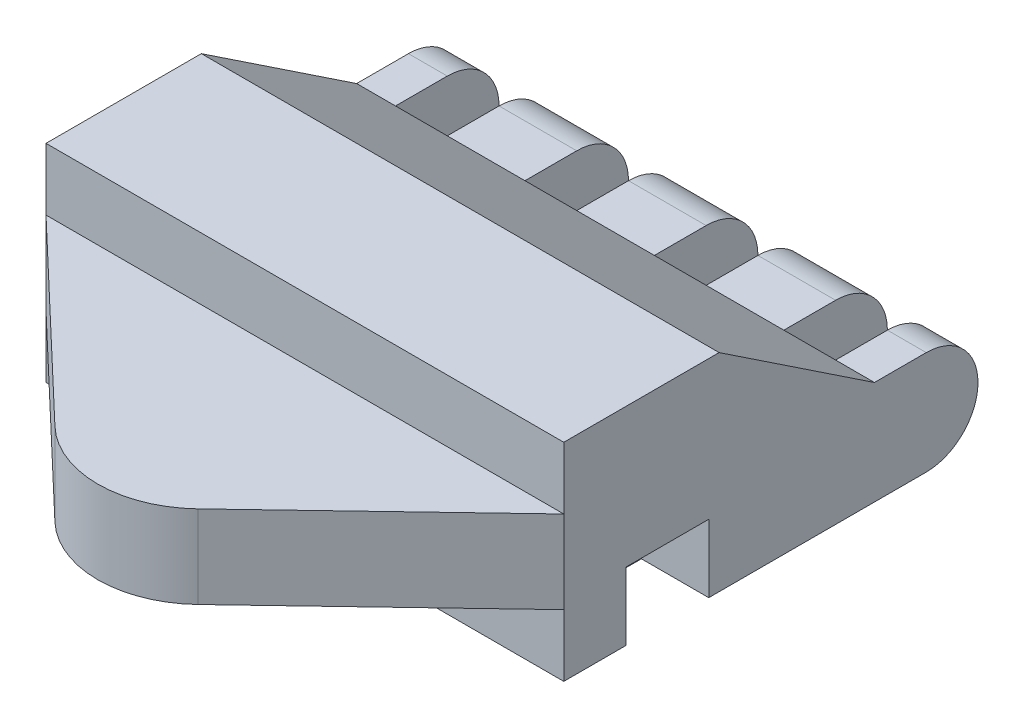
ISO-10303-21;
HEADER;
FILE_DESCRIPTION(('STEP AP214'),'2;1');
FILE_NAME('part.step','',(''),(''),'','','');
FILE_SCHEMA(('AUTOMOTIVE_DESIGN { 1 0 10303 214 1 1 1 1 }'));
ENDSEC;
DATA;
#1=APPLICATION_CONTEXT('core data for automotive mechanical design processes');
#2=APPLICATION_PROTOCOL_DEFINITION('international standard','automotive_design',2000,#1);
#3=PRODUCT_CONTEXT('',#1,'mechanical');
#4=PRODUCT('Part','Part','',(#3));
#5=PRODUCT_RELATED_PRODUCT_CATEGORY('part','',(#4));
#6=PRODUCT_DEFINITION_FORMATION('','',#4);
#7=PRODUCT_DEFINITION_CONTEXT('part definition',#1,'design');
#8=PRODUCT_DEFINITION('design','',#6,#7);
#9=PRODUCT_DEFINITION_SHAPE('','',#8);
#10=(LENGTH_UNIT() NAMED_UNIT(*) SI_UNIT(.MILLI.,.METRE.));
#11=(NAMED_UNIT(*) PLANE_ANGLE_UNIT() SI_UNIT($,.RADIAN.));
#12=(NAMED_UNIT(*) SI_UNIT($,.STERADIAN.) SOLID_ANGLE_UNIT());
#13=UNCERTAINTY_MEASURE_WITH_UNIT(LENGTH_MEASURE(1.E-05),#10,'distance_accuracy_value','');
#14=(GEOMETRIC_REPRESENTATION_CONTEXT(3) GLOBAL_UNCERTAINTY_ASSIGNED_CONTEXT((#13)) GLOBAL_UNIT_ASSIGNED_CONTEXT((#10,
#11,#12)) REPRESENTATION_CONTEXT('',''));
#15=CARTESIAN_POINT('',(0.,0.,0.));
#16=DIRECTION('',(0.,0.,1.));
#17=DIRECTION('',(1.,0.,0.));
#18=AXIS2_PLACEMENT_3D('',#15,#16,#17);
#19=CARTESIAN_POINT('',(50.,-10.,-90.));
#20=DIRECTION('',(-1.,0.,0.));
#21=DIRECTION('',(0.,0.,1.));
#22=AXIS2_PLACEMENT_3D('',#19,#20,#21);
#23=CYLINDRICAL_SURFACE('',#22,10.);
#24=CARTESIAN_POINT('',(-42.5,-10.,-90.));
#25=DIRECTION('',(-1.,0.,0.));
#26=DIRECTION('',(0.,0.,1.));
#27=AXIS2_PLACEMENT_3D('',#24,#25,#26);
#28=CIRCLE('',#27,10.);
#29=CARTESIAN_POINT('',(-42.5,-20.,-90.));
#30=VERTEX_POINT('',#29);
#31=CARTESIAN_POINT('',(-42.5,0.,-90.));
#32=VERTEX_POINT('',#31);
#33=EDGE_CURVE('E367',#30,#32,#28,.F.);
#34=ORIENTED_EDGE('',*,*,#33,.F.);
#35=DIRECTION('',(-1.,0.,0.));
#36=VECTOR('',#35,1.);
#37=CARTESIAN_POINT('',(50.,-20.,-90.));
#38=LINE('',#37,#36);
#39=CARTESIAN_POINT('',(-50.,-20.,-90.));
#40=VERTEX_POINT('',#39);
#41=EDGE_CURVE('E387',#30,#40,#38,.T.);
#42=ORIENTED_EDGE('',*,*,#41,.T.);
#43=CARTESIAN_POINT('',(-50.,-10.,-90.));
#44=DIRECTION('',(-1.,0.,0.));
#45=DIRECTION('',(0.,0.,1.));
#46=AXIS2_PLACEMENT_3D('',#43,#44,#45);
#47=CIRCLE('',#46,10.);
#48=CARTESIAN_POINT('',(-50.,0.,-90.));
#49=VERTEX_POINT('',#48);
#50=EDGE_CURVE('E374',#49,#40,#47,.T.);
#51=ORIENTED_EDGE('',*,*,#50,.F.);
#52=DIRECTION('',(-1.,0.,0.));
#53=VECTOR('',#52,1.);
#54=CARTESIAN_POINT('',(50.,0.,-90.));
#55=LINE('',#54,#53);
#56=EDGE_CURVE('E377',#32,#49,#55,.T.);
#57=ORIENTED_EDGE('',*,*,#56,.F.);
#58=EDGE_LOOP('',(#34,#42,#51,#57));
#59=FACE_BOUND('',#58,.T.);
#60=ADVANCED_FACE('F39',(#59),#23,.T.);
#61=CARTESIAN_POINT('',(-32.5,-10.,-90.));
#62=DIRECTION('',(1.,0.,0.));
#63=DIRECTION('',(0.,0.,-1.));
#64=AXIS2_PLACEMENT_3D('',#61,#62,#63);
#65=CIRCLE('',#64,10.);
#66=CARTESIAN_POINT('',(-32.5,0.,-90.));
#67=VERTEX_POINT('',#66);
#68=CARTESIAN_POINT('',(-32.5,-20.,-90.));
#69=VERTEX_POINT('',#68);
#70=EDGE_CURVE('E365',#67,#69,#65,.F.);
#71=ORIENTED_EDGE('',*,*,#70,.F.);
#72=CARTESIAN_POINT('',(-17.5,0.,-90.));
#73=VERTEX_POINT('',#72);
#74=EDGE_CURVE('E598',#73,#67,#55,.T.);
#75=ORIENTED_EDGE('',*,*,#74,.F.);
#76=CARTESIAN_POINT('',(-17.5,-10.,-90.));
#77=DIRECTION('',(-1.,0.,0.));
#78=DIRECTION('',(0.,0.,1.));
#79=AXIS2_PLACEMENT_3D('',#76,#77,#78);
#80=CIRCLE('',#79,10.);
#81=CARTESIAN_POINT('',(-17.5,-20.,-90.));
#82=VERTEX_POINT('',#81);
#83=EDGE_CURVE('E363',#82,#73,#80,.F.);
#84=ORIENTED_EDGE('',*,*,#83,.F.);
#85=EDGE_CURVE('E600',#82,#69,#38,.T.);
#86=ORIENTED_EDGE('',*,*,#85,.T.);
#87=EDGE_LOOP('',(#71,#75,#84,#86));
#88=FACE_BOUND('',#87,.T.);
#89=ADVANCED_FACE('F645',(#88),#23,.T.);
#90=CARTESIAN_POINT('',(-7.49999999999999,-10.,-90.));
#91=DIRECTION('',(1.,0.,0.));
#92=DIRECTION('',(0.,0.,-1.));
#93=AXIS2_PLACEMENT_3D('',#90,#91,#92);
#94=CIRCLE('',#93,10.);
#95=CARTESIAN_POINT('',(-7.49999999999999,0.,-90.));
#96=VERTEX_POINT('',#95);
#97=CARTESIAN_POINT('',(-7.49999999999999,-20.,-90.));
#98=VERTEX_POINT('',#97);
#99=EDGE_CURVE('E361',#96,#98,#94,.F.);
#100=ORIENTED_EDGE('',*,*,#99,.F.);
#101=CARTESIAN_POINT('',(7.5,0.,-90.));
#102=VERTEX_POINT('',#101);
#103=EDGE_CURVE('E631',#102,#96,#55,.T.);
#104=ORIENTED_EDGE('',*,*,#103,.F.);
#105=CARTESIAN_POINT('',(7.5,-10.,-90.));
#106=DIRECTION('',(-1.,0.,0.));
#107=DIRECTION('',(0.,0.,1.));
#108=AXIS2_PLACEMENT_3D('',#105,#106,#107);
#109=CIRCLE('',#108,10.);
#110=CARTESIAN_POINT('',(7.5,-20.,-90.));
#111=VERTEX_POINT('',#110);
#112=EDGE_CURVE('E359',#111,#102,#109,.F.);
#113=ORIENTED_EDGE('',*,*,#112,.F.);
#114=EDGE_CURVE('E602',#111,#98,#38,.T.);
#115=ORIENTED_EDGE('',*,*,#114,.T.);
#116=EDGE_LOOP('',(#100,#104,#113,#115));
#117=FACE_BOUND('',#116,.T.);
#118=ADVANCED_FACE('F704',(#117),#23,.T.);
#119=CARTESIAN_POINT('',(17.5,-10.,-90.));
#120=DIRECTION('',(1.,0.,0.));
#121=DIRECTION('',(0.,0.,-1.));
#122=AXIS2_PLACEMENT_3D('',#119,#120,#121);
#123=CIRCLE('',#122,10.);
#124=CARTESIAN_POINT('',(17.5,0.,-90.));
#125=VERTEX_POINT('',#124);
#126=CARTESIAN_POINT('',(17.5,-20.,-90.));
#127=VERTEX_POINT('',#126);
#128=EDGE_CURVE('E357',#125,#127,#123,.F.);
#129=ORIENTED_EDGE('',*,*,#128,.F.);
#130=CARTESIAN_POINT('',(32.5,0.,-90.));
#131=VERTEX_POINT('',#130);
#132=EDGE_CURVE('E391',#131,#125,#55,.T.);
#133=ORIENTED_EDGE('',*,*,#132,.F.);
#134=CARTESIAN_POINT('',(32.5,-10.,-90.));
#135=DIRECTION('',(-1.,0.,0.));
#136=DIRECTION('',(0.,0.,1.));
#137=AXIS2_PLACEMENT_3D('',#134,#135,#136);
#138=CIRCLE('',#137,10.);
#139=CARTESIAN_POINT('',(32.5,-20.,-90.));
#140=VERTEX_POINT('',#139);
#141=EDGE_CURVE('E355',#140,#131,#138,.F.);
#142=ORIENTED_EDGE('',*,*,#141,.F.);
#143=EDGE_CURVE('E386',#140,#127,#38,.T.);
#144=ORIENTED_EDGE('',*,*,#143,.T.);
#145=EDGE_LOOP('',(#129,#133,#142,#144));
#146=FACE_BOUND('',#145,.T.);
#147=ADVANCED_FACE('F614',(#146),#23,.T.);
#148=CARTESIAN_POINT('',(50.,0.,-90.));
#149=DIRECTION('',(0.,1.,0.));
#150=DIRECTION('',(0.,0.,1.));
#151=AXIS2_PLACEMENT_3D('',#148,#149,#150);
#152=PLANE('',#151);
#153=DIRECTION('',(0.,0.,1.));
#154=VECTOR('',#153,1.);
#155=CARTESIAN_POINT('',(-42.5,0.,-90.));
#156=LINE('',#155,#154);
#157=CARTESIAN_POINT('',(-42.5,0.,-80.));
#158=VERTEX_POINT('',#157);
#159=EDGE_CURVE('E484',#32,#158,#156,.T.);
#160=ORIENTED_EDGE('',*,*,#159,.F.);
#161=ORIENTED_EDGE('',*,*,#56,.T.);
#162=DIRECTION('',(0.,0.,-1.));
#163=VECTOR('',#162,1.);
#164=CARTESIAN_POINT('',(-50.,0.,-90.));
#165=LINE('',#164,#163);
#166=CARTESIAN_POINT('',(-50.,0.,-80.));
#167=VERTEX_POINT('',#166);
#168=EDGE_CURVE('E369',#167,#49,#165,.T.);
#169=ORIENTED_EDGE('',*,*,#168,.F.);
#170=DIRECTION('',(1.,0.,0.));
#171=VECTOR('',#170,1.);
#172=CARTESIAN_POINT('',(-50.,0.,-80.));
#173=LINE('',#172,#171);
#174=EDGE_CURVE('E581',#167,#158,#173,.T.);
#175=ORIENTED_EDGE('',*,*,#174,.T.);
#176=EDGE_LOOP('',(#160,#161,#169,#175));
#177=FACE_BOUND('',#176,.T.);
#178=ADVANCED_FACE('F594',(#177),#152,.T.);
#179=DIRECTION('',(0.,0.,-1.));
#180=VECTOR('',#179,1.);
#181=CARTESIAN_POINT('',(-32.5,0.,-90.));
#182=LINE('',#181,#180);
#183=CARTESIAN_POINT('',(-32.5,0.,-80.));
#184=VERTEX_POINT('',#183);
#185=EDGE_CURVE('E481',#184,#67,#182,.T.);
#186=ORIENTED_EDGE('',*,*,#185,.F.);
#187=CARTESIAN_POINT('',(-17.5,0.,-80.));
#188=VERTEX_POINT('',#187);
#189=EDGE_CURVE('E655',#184,#188,#173,.T.);
#190=ORIENTED_EDGE('',*,*,#189,.T.);
#191=DIRECTION('',(0.,0.,1.));
#192=VECTOR('',#191,1.);
#193=CARTESIAN_POINT('',(-17.5,0.,-90.));
#194=LINE('',#193,#192);
#195=EDGE_CURVE('E479',#73,#188,#194,.T.);
#196=ORIENTED_EDGE('',*,*,#195,.F.);
#197=ORIENTED_EDGE('',*,*,#74,.T.);
#198=EDGE_LOOP('',(#186,#190,#196,#197));
#199=FACE_BOUND('',#198,.T.);
#200=ADVANCED_FACE('F642',(#199),#152,.T.);
#201=DIRECTION('',(0.,0.,-1.));
#202=VECTOR('',#201,1.);
#203=CARTESIAN_POINT('',(-7.49999999999999,0.,-90.));
#204=LINE('',#203,#202);
#205=CARTESIAN_POINT('',(-7.49999999999999,0.,-80.));
#206=VERTEX_POINT('',#205);
#207=EDGE_CURVE('E476',#206,#96,#204,.T.);
#208=ORIENTED_EDGE('',*,*,#207,.F.);
#209=CARTESIAN_POINT('',(7.5,0.,-80.));
#210=VERTEX_POINT('',#209);
#211=EDGE_CURVE('E658',#206,#210,#173,.T.);
#212=ORIENTED_EDGE('',*,*,#211,.T.);
#213=DIRECTION('',(0.,0.,1.));
#214=VECTOR('',#213,1.);
#215=CARTESIAN_POINT('',(7.5,0.,-90.));
#216=LINE('',#215,#214);
#217=EDGE_CURVE('E474',#102,#210,#216,.T.);
#218=ORIENTED_EDGE('',*,*,#217,.F.);
#219=ORIENTED_EDGE('',*,*,#103,.T.);
#220=EDGE_LOOP('',(#208,#212,#218,#219));
#221=FACE_BOUND('',#220,.T.);
#222=ADVANCED_FACE('F723',(#221),#152,.T.);
#223=DIRECTION('',(0.,0.,-1.));
#224=VECTOR('',#223,1.);
#225=CARTESIAN_POINT('',(17.5,0.,-90.));
#226=LINE('',#225,#224);
#227=CARTESIAN_POINT('',(17.5,0.,-80.));
#228=VERTEX_POINT('',#227);
#229=EDGE_CURVE('E471',#228,#125,#226,.T.);
#230=ORIENTED_EDGE('',*,*,#229,.F.);
#231=CARTESIAN_POINT('',(32.5,0.,-80.));
#232=VERTEX_POINT('',#231);
#233=EDGE_CURVE('E665',#228,#232,#173,.T.);
#234=ORIENTED_EDGE('',*,*,#233,.T.);
#235=DIRECTION('',(0.,0.,1.));
#236=VECTOR('',#235,1.);
#237=CARTESIAN_POINT('',(32.5,0.,-90.));
#238=LINE('',#237,#236);
#239=EDGE_CURVE('E469',#131,#232,#238,.T.);
#240=ORIENTED_EDGE('',*,*,#239,.F.);
#241=ORIENTED_EDGE('',*,*,#132,.T.);
#242=EDGE_LOOP('',(#230,#234,#240,#241));
#243=FACE_BOUND('',#242,.T.);
#244=ADVANCED_FACE('F630',(#243),#152,.T.);
#245=CARTESIAN_POINT('',(-50.,20.,-20.));
#246=DIRECTION('',(0.689655172413793,0.,-0.724137931034483));
#247=DIRECTION('',(-0.724137931034483,0.,-0.689655172413793));
#248=AXIS2_PLACEMENT_3D('',#245,#246,#247);
#249=PLANE('',#248);
#250=DIRECTION('',(0.,-1.,0.));
#251=VECTOR('',#250,1.);
#252=CARTESIAN_POINT('',(-50.,20.,-20.));
#253=LINE('',#252,#251);
#254=CARTESIAN_POINT('',(-50.,8.,-20.));
#255=VERTEX_POINT('',#254);
#256=CARTESIAN_POINT('',(-50.,-8.,-20.));
#257=VERTEX_POINT('',#256);
#258=EDGE_CURVE('E518',#255,#257,#253,.T.);
#259=ORIENTED_EDGE('',*,*,#258,.T.);
#260=DIRECTION('',(0.724137931034483,0.,0.689655172413793));
#261=VECTOR('',#260,1.);
#262=CARTESIAN_POINT('',(-50.,-8.,-20.));
#263=LINE('',#262,#261);
#264=CARTESIAN_POINT('',(-13.7931034482759,-8.,14.4827586206897));
#265=VERTEX_POINT('',#264);
#266=EDGE_CURVE('E539',#257,#265,#263,.T.);
#267=ORIENTED_EDGE('',*,*,#266,.T.);
#268=DIRECTION('',(0.,-1.,0.));
#269=VECTOR('',#268,1.);
#270=CARTESIAN_POINT('',(-13.7931034482759,20.,14.4827586206897));
#271=LINE('',#270,#269);
#272=CARTESIAN_POINT('',(-13.7931034482759,8.,14.4827586206897));
#273=VERTEX_POINT('',#272);
#274=EDGE_CURVE('E515',#273,#265,#271,.T.);
#275=ORIENTED_EDGE('',*,*,#274,.F.);
#276=DIRECTION('',(0.724137931034483,0.,0.689655172413793));
#277=VECTOR('',#276,1.);
#278=CARTESIAN_POINT('',(-50.,8.,-20.));
#279=LINE('',#278,#277);
#280=EDGE_CURVE('E566',#255,#273,#279,.T.);
#281=ORIENTED_EDGE('',*,*,#280,.F.);
#282=EDGE_LOOP('',(#259,#267,#275,#281));
#283=FACE_BOUND('',#282,.T.);
#284=ADVANCED_FACE('F564',(#283),#249,.F.);
#285=CARTESIAN_POINT('',(0.,20.,0.));
#286=DIRECTION('',(0.,-1.,0.));
#287=DIRECTION('',(0.,0.,-1.));
#288=AXIS2_PLACEMENT_3D('',#285,#286,#287);
#289=CYLINDRICAL_SURFACE('',#288,20.);
#290=ORIENTED_EDGE('',*,*,#274,.T.);
#291=CARTESIAN_POINT('',(0.,-8.,0.));
#292=DIRECTION('',(0.,1.,0.));
#293=DIRECTION('',(0.,0.,1.));
#294=AXIS2_PLACEMENT_3D('',#291,#292,#293);
#295=CIRCLE('',#294,20.);
#296=CARTESIAN_POINT('',(13.7931034482759,-8.,14.4827586206897));
#297=VERTEX_POINT('',#296);
#298=EDGE_CURVE('E572',#265,#297,#295,.T.);
#299=ORIENTED_EDGE('',*,*,#298,.T.);
#300=DIRECTION('',(0.,-1.,0.));
#301=VECTOR('',#300,1.);
#302=CARTESIAN_POINT('',(13.7931034482759,20.,14.4827586206897));
#303=LINE('',#302,#301);
#304=CARTESIAN_POINT('',(13.7931034482759,8.,14.4827586206897));
#305=VERTEX_POINT('',#304);
#306=EDGE_CURVE('E511',#305,#297,#303,.T.);
#307=ORIENTED_EDGE('',*,*,#306,.F.);
#308=CARTESIAN_POINT('',(0.,8.,0.));
#309=DIRECTION('',(0.,1.,0.));
#310=DIRECTION('',(0.,0.,1.));
#311=AXIS2_PLACEMENT_3D('',#308,#309,#310);
#312=CIRCLE('',#311,20.);
#313=EDGE_CURVE('E530',#273,#305,#312,.T.);
#314=ORIENTED_EDGE('',*,*,#313,.F.);
#315=EDGE_LOOP('',(#290,#299,#307,#314));
#316=FACE_BOUND('',#315,.T.);
#317=ADVANCED_FACE('F761',(#316),#289,.T.);
#318=CARTESIAN_POINT('',(50.,20.,-20.));
#319=DIRECTION('',(-0.689655172413793,0.,-0.724137931034483));
#320=DIRECTION('',(-0.724137931034483,0.,0.689655172413793));
#321=AXIS2_PLACEMENT_3D('',#318,#319,#320);
#322=PLANE('',#321);
#323=ORIENTED_EDGE('',*,*,#306,.T.);
#324=DIRECTION('',(0.724137931034483,0.,-0.689655172413793));
#325=VECTOR('',#324,1.);
#326=CARTESIAN_POINT('',(50.,-8.,-20.));
#327=LINE('',#326,#325);
#328=CARTESIAN_POINT('',(50.,-8.,-20.));
#329=VERTEX_POINT('',#328);
#330=EDGE_CURVE('E457',#297,#329,#327,.T.);
#331=ORIENTED_EDGE('',*,*,#330,.T.);
#332=DIRECTION('',(0.,-1.,0.));
#333=VECTOR('',#332,1.);
#334=CARTESIAN_POINT('',(50.,20.,-20.));
#335=LINE('',#334,#333);
#336=CARTESIAN_POINT('',(50.,8.,-20.));
#337=VERTEX_POINT('',#336);
#338=EDGE_CURVE('E512',#337,#329,#335,.T.);
#339=ORIENTED_EDGE('',*,*,#338,.F.);
#340=DIRECTION('',(0.724137931034483,0.,-0.689655172413793));
#341=VECTOR('',#340,1.);
#342=CARTESIAN_POINT('',(50.,8.,-20.));
#343=LINE('',#342,#341);
#344=EDGE_CURVE('E460',#305,#337,#343,.T.);
#345=ORIENTED_EDGE('',*,*,#344,.F.);
#346=EDGE_LOOP('',(#323,#331,#339,#345));
#347=FACE_BOUND('',#346,.T.);
#348=ADVANCED_FACE('F542',(#347),#322,.F.);
#349=CARTESIAN_POINT('',(50.,20.,-20.));
#350=DIRECTION('',(-1.,0.,0.));
#351=DIRECTION('',(0.,0.,1.));
#352=AXIS2_PLACEMENT_3D('',#349,#350,#351);
#353=PLANE('',#352);
#354=DIRECTION('',(0.,0.,1.));
#355=VECTOR('',#354,1.);
#356=CARTESIAN_POINT('',(50.,-6.87993796476622,-20.));
#357=LINE('',#356,#355);
#358=CARTESIAN_POINT('',(50.,-6.87993796476622,-48.));
#359=VERTEX_POINT('',#358);
#360=CARTESIAN_POINT('',(50.,-6.87993796476622,-32.));
#361=VERTEX_POINT('',#360);
#362=EDGE_CURVE('E465',#359,#361,#357,.T.);
#363=ORIENTED_EDGE('',*,*,#362,.F.);
#364=DIRECTION('',(0.,-1.,0.));
#365=VECTOR('',#364,1.);
#366=CARTESIAN_POINT('',(50.,20.,-48.));
#367=LINE('',#366,#365);
#368=CARTESIAN_POINT('',(50.,-20.,-48.));
#369=VERTEX_POINT('',#368);
#370=EDGE_CURVE('E410',#359,#369,#367,.T.);
#371=ORIENTED_EDGE('',*,*,#370,.T.);
#372=DIRECTION('',(0.,0.,-1.));
#373=VECTOR('',#372,1.);
#374=CARTESIAN_POINT('',(50.,-20.,-20.));
#375=LINE('',#374,#373);
#376=CARTESIAN_POINT('',(50.,-20.,-90.));
#377=VERTEX_POINT('',#376);
#378=EDGE_CURVE('E567',#369,#377,#375,.T.);
#379=ORIENTED_EDGE('',*,*,#378,.T.);
#380=CARTESIAN_POINT('',(50.,-10.,-90.));
#381=DIRECTION('',(-1.,0.,0.));
#382=DIRECTION('',(0.,0.,1.));
#383=AXIS2_PLACEMENT_3D('',#380,#381,#382);
#384=CIRCLE('',#383,10.);
#385=CARTESIAN_POINT('',(50.,0.,-90.));
#386=VERTEX_POINT('',#385);
#387=EDGE_CURVE('E373',#386,#377,#384,.T.);
#388=ORIENTED_EDGE('',*,*,#387,.F.);
#389=DIRECTION('',(0.,0.,-1.));
#390=VECTOR('',#389,1.);
#391=CARTESIAN_POINT('',(50.,0.,-90.));
#392=LINE('',#391,#390);
#393=CARTESIAN_POINT('',(50.,0.,-80.));
#394=VERTEX_POINT('',#393);
#395=EDGE_CURVE('E370',#394,#386,#392,.T.);
#396=ORIENTED_EDGE('',*,*,#395,.F.);
#397=DIRECTION('',(0.,-0.554700196225229,-0.832050294337844));
#398=VECTOR('',#397,1.);
#399=CARTESIAN_POINT('',(50.,0.,-80.));
#400=LINE('',#399,#398);
#401=CARTESIAN_POINT('',(50.,20.,-50.));
#402=VERTEX_POINT('',#401);
#403=EDGE_CURVE('E550',#402,#394,#400,.T.);
#404=ORIENTED_EDGE('',*,*,#403,.F.);
#405=DIRECTION('',(0.,0.,-1.));
#406=VECTOR('',#405,1.);
#407=CARTESIAN_POINT('',(50.,20.,-20.));
#408=LINE('',#407,#406);
#409=CARTESIAN_POINT('',(50.,20.,-20.));
#410=VERTEX_POINT('',#409);
#411=EDGE_CURVE('E498',#410,#402,#408,.T.);
#412=ORIENTED_EDGE('',*,*,#411,.F.);
#413=EDGE_CURVE('E508',#410,#337,#335,.T.);
#414=ORIENTED_EDGE('',*,*,#413,.T.);
#415=ORIENTED_EDGE('',*,*,#338,.T.);
#416=DIRECTION('',(0.,-1.,0.));
#417=VECTOR('',#416,1.);
#418=CARTESIAN_POINT('',(50.,20.,-20.));
#419=LINE('',#418,#417);
#420=CARTESIAN_POINT('',(50.,-20.,-20.));
#421=VERTEX_POINT('',#420);
#422=EDGE_CURVE('E575',#329,#421,#419,.T.);
#423=ORIENTED_EDGE('',*,*,#422,.T.);
#424=CARTESIAN_POINT('',(50.,-20.,-32.));
#425=VERTEX_POINT('',#424);
#426=EDGE_CURVE('E504',#421,#425,#375,.T.);
#427=ORIENTED_EDGE('',*,*,#426,.T.);
#428=DIRECTION('',(0.,-1.,0.));
#429=VECTOR('',#428,1.);
#430=CARTESIAN_POINT('',(50.,20.,-32.));
#431=LINE('',#430,#429);
#432=EDGE_CURVE('E408',#361,#425,#431,.T.);
#433=ORIENTED_EDGE('',*,*,#432,.F.);
#434=EDGE_LOOP('',(#363,#371,#379,#388,#396,#404,#412,#414,#415,#423,#427,#433));
#435=FACE_BOUND('',#434,.T.);
#436=ADVANCED_FACE('F41',(#435),#353,.F.);
#437=CARTESIAN_POINT('',(-50.,20.,-20.));
#438=DIRECTION('',(1.,0.,0.));
#439=DIRECTION('',(0.,0.,-1.));
#440=AXIS2_PLACEMENT_3D('',#437,#438,#439);
#441=PLANE('',#440);
#442=DIRECTION('',(0.,0.,1.));
#443=VECTOR('',#442,1.);
#444=CARTESIAN_POINT('',(-50.,-20.,-20.));
#445=LINE('',#444,#443);
#446=CARTESIAN_POINT('',(-50.,-20.,-48.));
#447=VERTEX_POINT('',#446);
#448=EDGE_CURVE('E493',#40,#447,#445,.T.);
#449=ORIENTED_EDGE('',*,*,#448,.T.);
#450=DIRECTION('',(0.,1.,0.));
#451=VECTOR('',#450,1.);
#452=CARTESIAN_POINT('',(-50.,20.,-48.));
#453=LINE('',#452,#451);
#454=CARTESIAN_POINT('',(-50.,-7.,-48.));
#455=VERTEX_POINT('',#454);
#456=EDGE_CURVE('E305',#447,#455,#453,.T.);
#457=ORIENTED_EDGE('',*,*,#456,.T.);
#458=DIRECTION('',(0.,0.,-1.));
#459=VECTOR('',#458,1.);
#460=CARTESIAN_POINT('',(-50.,-7.,-20.));
#461=LINE('',#460,#459);
#462=CARTESIAN_POINT('',(-50.,-7.,-32.));
#463=VERTEX_POINT('',#462);
#464=EDGE_CURVE('E12',#463,#455,#461,.T.);
#465=ORIENTED_EDGE('',*,*,#464,.F.);
#466=DIRECTION('',(0.,1.,0.));
#467=VECTOR('',#466,1.);
#468=CARTESIAN_POINT('',(-50.,20.,-32.));
#469=LINE('',#468,#467);
#470=CARTESIAN_POINT('',(-50.,-20.,-32.));
#471=VERTEX_POINT('',#470);
#472=EDGE_CURVE('E289',#471,#463,#469,.T.);
#473=ORIENTED_EDGE('',*,*,#472,.F.);
#474=CARTESIAN_POINT('',(-50.,-20.,-20.));
#475=VERTEX_POINT('',#474);
#476=EDGE_CURVE('E499',#471,#475,#445,.T.);
#477=ORIENTED_EDGE('',*,*,#476,.T.);
#478=DIRECTION('',(0.,-1.,0.));
#479=VECTOR('',#478,1.);
#480=CARTESIAN_POINT('',(-50.,-8.,-20.));
#481=LINE('',#480,#479);
#482=EDGE_CURVE('E561',#257,#475,#481,.T.);
#483=ORIENTED_EDGE('',*,*,#482,.F.);
#484=ORIENTED_EDGE('',*,*,#258,.F.);
#485=CARTESIAN_POINT('',(-50.,20.,-20.));
#486=VERTEX_POINT('',#485);
#487=EDGE_CURVE('E519',#486,#255,#253,.T.);
#488=ORIENTED_EDGE('',*,*,#487,.F.);
#489=DIRECTION('',(0.,0.,1.));
#490=VECTOR('',#489,1.);
#491=CARTESIAN_POINT('',(-50.,20.,-20.));
#492=LINE('',#491,#490);
#493=CARTESIAN_POINT('',(-50.,20.,-50.));
#494=VERTEX_POINT('',#493);
#495=EDGE_CURVE('E502',#494,#486,#492,.T.);
#496=ORIENTED_EDGE('',*,*,#495,.F.);
#497=DIRECTION('',(0.,-0.554700196225229,-0.832050294337844));
#498=VECTOR('',#497,1.);
#499=CARTESIAN_POINT('',(-50.,0.,-80.));
#500=LINE('',#499,#498);
#501=EDGE_CURVE('E586',#494,#167,#500,.T.);
#502=ORIENTED_EDGE('',*,*,#501,.T.);
#503=ORIENTED_EDGE('',*,*,#168,.T.);
#504=ORIENTED_EDGE('',*,*,#50,.T.);
#505=EDGE_LOOP('',(#449,#457,#465,#473,#477,#483,#484,#488,#496,#502,#503,#504));
#506=FACE_BOUND('',#505,.T.);
#507=ADVANCED_FACE('F496',(#506),#441,.F.);
#508=CARTESIAN_POINT('',(0.,20.,0.));
#509=DIRECTION('',(0.,1.,0.));
#510=DIRECTION('',(0.,0.,1.));
#511=AXIS2_PLACEMENT_3D('',#508,#509,#510);
#512=PLANE('',#511);
#513=DIRECTION('',(1.,0.,0.));
#514=VECTOR('',#513,1.);
#515=CARTESIAN_POINT('',(-50.,20.,-50.));
#516=LINE('',#515,#514);
#517=EDGE_CURVE('E554',#494,#402,#516,.T.);
#518=ORIENTED_EDGE('',*,*,#517,.F.);
#519=ORIENTED_EDGE('',*,*,#495,.T.);
#520=DIRECTION('',(-1.,0.,0.));
#521=VECTOR('',#520,1.);
#522=CARTESIAN_POINT('',(0.,20.,-20.));
#523=LINE('',#522,#521);
#524=EDGE_CURVE('E522',#410,#486,#523,.T.);
#525=ORIENTED_EDGE('',*,*,#524,.F.);
#526=ORIENTED_EDGE('',*,*,#411,.T.);
#527=EDGE_LOOP('',(#518,#519,#525,#526));
#528=FACE_BOUND('',#527,.T.);
#529=ADVANCED_FACE('F553',(#528),#512,.T.);
#530=CARTESIAN_POINT('',(0.,-20.,0.));
#531=DIRECTION('',(0.,1.,0.));
#532=DIRECTION('',(0.,0.,1.));
#533=AXIS2_PLACEMENT_3D('',#530,#531,#532);
#534=PLANE('',#533);
#535=DIRECTION('',(0.,0.,1.));
#536=VECTOR('',#535,1.);
#537=CARTESIAN_POINT('',(-37.,-20.,0.));
#538=LINE('',#537,#536);
#539=CARTESIAN_POINT('',(-37.,-20.,-48.));
#540=VERTEX_POINT('',#539);
#541=CARTESIAN_POINT('',(-37.,-20.,-32.));
#542=VERTEX_POINT('',#541);
#543=EDGE_CURVE('E488',#540,#542,#538,.T.);
#544=ORIENTED_EDGE('',*,*,#543,.F.);
#545=DIRECTION('',(-1.,0.,0.));
#546=VECTOR('',#545,1.);
#547=CARTESIAN_POINT('',(0.,-20.,-48.));
#548=LINE('',#547,#546);
#549=EDGE_CURVE('E47',#540,#447,#548,.T.);
#550=ORIENTED_EDGE('',*,*,#549,.T.);
#551=ORIENTED_EDGE('',*,*,#448,.F.);
#552=ORIENTED_EDGE('',*,*,#41,.F.);
#553=DIRECTION('',(0.,0.,-1.));
#554=VECTOR('',#553,1.);
#555=CARTESIAN_POINT('',(-42.5,-20.,-80.));
#556=LINE('',#555,#554);
#557=CARTESIAN_POINT('',(-42.5,-20.,-80.));
#558=VERTEX_POINT('',#557);
#559=EDGE_CURVE('E308',#558,#30,#556,.T.);
#560=ORIENTED_EDGE('',*,*,#559,.F.);
#561=DIRECTION('',(-1.,0.,0.));
#562=VECTOR('',#561,1.);
#563=CARTESIAN_POINT('',(-42.5,-20.,-80.));
#564=LINE('',#563,#562);
#565=CARTESIAN_POINT('',(-32.5,-20.,-80.));
#566=VERTEX_POINT('',#565);
#567=EDGE_CURVE('E314',#566,#558,#564,.T.);
#568=ORIENTED_EDGE('',*,*,#567,.F.);
#569=DIRECTION('',(0.,0.,1.));
#570=VECTOR('',#569,1.);
#571=CARTESIAN_POINT('',(-32.5,-20.,-80.));
#572=LINE('',#571,#570);
#573=EDGE_CURVE('E310',#69,#566,#572,.T.);
#574=ORIENTED_EDGE('',*,*,#573,.F.);
#575=ORIENTED_EDGE('',*,*,#85,.F.);
#576=DIRECTION('',(0.,0.,-1.));
#577=VECTOR('',#576,1.);
#578=CARTESIAN_POINT('',(-17.5,-20.,-80.));
#579=LINE('',#578,#577);
#580=CARTESIAN_POINT('',(-17.5,-20.,-80.));
#581=VERTEX_POINT('',#580);
#582=EDGE_CURVE('E322',#581,#82,#579,.T.);
#583=ORIENTED_EDGE('',*,*,#582,.F.);
#584=DIRECTION('',(-1.,0.,0.));
#585=VECTOR('',#584,1.);
#586=CARTESIAN_POINT('',(-17.5,-20.,-80.));
#587=LINE('',#586,#585);
#588=CARTESIAN_POINT('',(-7.49999999999999,-20.,-80.));
#589=VERTEX_POINT('',#588);
#590=EDGE_CURVE('E328',#589,#581,#587,.T.);
#591=ORIENTED_EDGE('',*,*,#590,.F.);
#592=DIRECTION('',(0.,0.,1.));
#593=VECTOR('',#592,1.);
#594=CARTESIAN_POINT('',(-7.49999999999999,-20.,-80.));
#595=LINE('',#594,#593);
#596=EDGE_CURVE('E324',#98,#589,#595,.T.);
#597=ORIENTED_EDGE('',*,*,#596,.F.);
#598=ORIENTED_EDGE('',*,*,#114,.F.);
#599=DIRECTION('',(0.,0.,-1.));
#600=VECTOR('',#599,1.);
#601=CARTESIAN_POINT('',(7.5,-20.,-80.));
#602=LINE('',#601,#600);
#603=CARTESIAN_POINT('',(7.5,-20.,-80.));
#604=VERTEX_POINT('',#603);
#605=EDGE_CURVE('E334',#604,#111,#602,.T.);
#606=ORIENTED_EDGE('',*,*,#605,.F.);
#607=DIRECTION('',(-1.,0.,0.));
#608=VECTOR('',#607,1.);
#609=CARTESIAN_POINT('',(7.5,-20.,-80.));
#610=LINE('',#609,#608);
#611=CARTESIAN_POINT('',(17.5,-20.,-80.));
#612=VERTEX_POINT('',#611);
#613=EDGE_CURVE('E340',#612,#604,#610,.T.);
#614=ORIENTED_EDGE('',*,*,#613,.F.);
#615=DIRECTION('',(0.,0.,1.));
#616=VECTOR('',#615,1.);
#617=CARTESIAN_POINT('',(17.5,-20.,-80.));
#618=LINE('',#617,#616);
#619=EDGE_CURVE('E336',#127,#612,#618,.T.);
#620=ORIENTED_EDGE('',*,*,#619,.F.);
#621=ORIENTED_EDGE('',*,*,#143,.F.);
#622=DIRECTION('',(0.,0.,-1.));
#623=VECTOR('',#622,1.);
#624=CARTESIAN_POINT('',(32.5,-20.,-80.));
#625=LINE('',#624,#623);
#626=CARTESIAN_POINT('',(32.5,-20.,-80.));
#627=VERTEX_POINT('',#626);
#628=EDGE_CURVE('E307',#627,#140,#625,.T.);
#629=ORIENTED_EDGE('',*,*,#628,.F.);
#630=DIRECTION('',(-1.,0.,0.));
#631=VECTOR('',#630,1.);
#632=CARTESIAN_POINT('',(32.5,-20.,-80.));
#633=LINE('',#632,#631);
#634=CARTESIAN_POINT('',(42.5,-20.,-80.));
#635=VERTEX_POINT('',#634);
#636=EDGE_CURVE('E349',#635,#627,#633,.T.);
#637=ORIENTED_EDGE('',*,*,#636,.F.);
#638=DIRECTION('',(0.,0.,1.));
#639=VECTOR('',#638,1.);
#640=CARTESIAN_POINT('',(42.5,-20.,-80.));
#641=LINE('',#640,#639);
#642=CARTESIAN_POINT('',(42.5,-20.,-90.));
#643=VERTEX_POINT('',#642);
#644=EDGE_CURVE('E347',#643,#635,#641,.T.);
#645=ORIENTED_EDGE('',*,*,#644,.F.);
#646=EDGE_CURVE('E382',#377,#643,#38,.T.);
#647=ORIENTED_EDGE('',*,*,#646,.F.);
#648=ORIENTED_EDGE('',*,*,#378,.F.);
#649=DIRECTION('',(-1.,0.,0.));
#650=VECTOR('',#649,1.);
#651=CARTESIAN_POINT('',(0.,-20.,-48.));
#652=LINE('',#651,#650);
#653=CARTESIAN_POINT('',(37.,-20.,-48.));
#654=VERTEX_POINT('',#653);
#655=EDGE_CURVE('E452',#369,#654,#652,.T.);
#656=ORIENTED_EDGE('',*,*,#655,.T.);
#657=DIRECTION('',(0.,0.,-1.));
#658=VECTOR('',#657,1.);
#659=CARTESIAN_POINT('',(37.,-20.,0.));
#660=LINE('',#659,#658);
#661=CARTESIAN_POINT('',(37.,-20.,-32.));
#662=VERTEX_POINT('',#661);
#663=EDGE_CURVE('E441',#662,#654,#660,.T.);
#664=ORIENTED_EDGE('',*,*,#663,.F.);
#665=DIRECTION('',(-1.,0.,0.));
#666=VECTOR('',#665,1.);
#667=CARTESIAN_POINT('',(0.,-20.,-32.));
#668=LINE('',#667,#666);
#669=EDGE_CURVE('E445',#425,#662,#668,.T.);
#670=ORIENTED_EDGE('',*,*,#669,.F.);
#671=ORIENTED_EDGE('',*,*,#426,.F.);
#672=DIRECTION('',(1.,0.,0.));
#673=VECTOR('',#672,1.);
#674=CARTESIAN_POINT('',(-50.,-20.,-20.));
#675=LINE('',#674,#673);
#676=EDGE_CURVE('E579',#475,#421,#675,.T.);
#677=ORIENTED_EDGE('',*,*,#676,.F.);
#678=ORIENTED_EDGE('',*,*,#476,.F.);
#679=DIRECTION('',(-1.,0.,0.));
#680=VECTOR('',#679,1.);
#681=CARTESIAN_POINT('',(0.,-20.,-32.));
#682=LINE('',#681,#680);
#683=EDGE_CURVE('E486',#542,#471,#682,.T.);
#684=ORIENTED_EDGE('',*,*,#683,.F.);
#685=EDGE_LOOP('',(#544,#550,#551,#552,#560,#568,#574,#575,#583,#591,#597,#598,#606,#614,#620,
#621,#629,#637,#645,#647,#648,#656,#664,#670,#671,#677,#678,#684));
#686=FACE_BOUND('',#685,.T.);
#687=ADVANCED_FACE('F455',(#686),#534,.F.);
#688=CARTESIAN_POINT('',(0.,8.,0.));
#689=DIRECTION('',(0.,1.,0.));
#690=DIRECTION('',(0.,0.,1.));
#691=AXIS2_PLACEMENT_3D('',#688,#689,#690);
#692=PLANE('',#691);
#693=ORIENTED_EDGE('',*,*,#280,.T.);
#694=ORIENTED_EDGE('',*,*,#313,.T.);
#695=ORIENTED_EDGE('',*,*,#344,.T.);
#696=DIRECTION('',(-1.,0.,0.));
#697=VECTOR('',#696,1.);
#698=CARTESIAN_POINT('',(-50.,8.,-20.));
#699=LINE('',#698,#697);
#700=EDGE_CURVE('E528',#337,#255,#699,.T.);
#701=ORIENTED_EDGE('',*,*,#700,.T.);
#702=EDGE_LOOP('',(#693,#694,#695,#701));
#703=FACE_BOUND('',#702,.T.);
#704=ADVANCED_FACE('F527',(#703),#692,.T.);
#705=CARTESIAN_POINT('',(-50.,8.,-20.));
#706=DIRECTION('',(0.,0.,-1.));
#707=DIRECTION('',(-1.,0.,0.));
#708=AXIS2_PLACEMENT_3D('',#705,#706,#707);
#709=PLANE('',#708);
#710=ORIENTED_EDGE('',*,*,#524,.T.);
#711=ORIENTED_EDGE('',*,*,#487,.T.);
#712=ORIENTED_EDGE('',*,*,#700,.F.);
#713=ORIENTED_EDGE('',*,*,#413,.F.);
#714=EDGE_LOOP('',(#710,#711,#712,#713));
#715=FACE_BOUND('',#714,.T.);
#716=ADVANCED_FACE('F535',(#715),#709,.F.);
#717=CARTESIAN_POINT('',(0.,-8.,0.));
#718=DIRECTION('',(0.,1.,0.));
#719=DIRECTION('',(0.,0.,1.));
#720=AXIS2_PLACEMENT_3D('',#717,#718,#719);
#721=PLANE('',#720);
#722=DIRECTION('',(1.,0.,0.));
#723=VECTOR('',#722,1.);
#724=CARTESIAN_POINT('',(-50.,-8.,-20.));
#725=LINE('',#724,#723);
#726=EDGE_CURVE('E578',#257,#329,#725,.T.);
#727=ORIENTED_EDGE('',*,*,#726,.T.);
#728=ORIENTED_EDGE('',*,*,#330,.F.);
#729=ORIENTED_EDGE('',*,*,#298,.F.);
#730=ORIENTED_EDGE('',*,*,#266,.F.);
#731=EDGE_LOOP('',(#727,#728,#729,#730));
#732=FACE_BOUND('',#731,.T.);
#733=ADVANCED_FACE('F744',(#732),#721,.F.);
#734=CARTESIAN_POINT('',(-50.,-8.,-20.));
#735=DIRECTION('',(0.,0.,-1.));
#736=DIRECTION('',(-1.,0.,0.));
#737=AXIS2_PLACEMENT_3D('',#734,#735,#736);
#738=PLANE('',#737);
#739=ORIENTED_EDGE('',*,*,#726,.F.);
#740=ORIENTED_EDGE('',*,*,#482,.T.);
#741=ORIENTED_EDGE('',*,*,#676,.T.);
#742=ORIENTED_EDGE('',*,*,#422,.F.);
#743=EDGE_LOOP('',(#739,#740,#741,#742));
#744=FACE_BOUND('',#743,.T.);
#745=ADVANCED_FACE('F743',(#744),#738,.F.);
#746=CARTESIAN_POINT('',(-50.,0.,-80.));
#747=DIRECTION('',(0.,-0.832050294337843,0.554700196225229));
#748=DIRECTION('',(0.,-0.554700196225229,-0.832050294337844));
#749=AXIS2_PLACEMENT_3D('',#746,#747,#748);
#750=PLANE('',#749);
#751=ORIENTED_EDGE('',*,*,#403,.T.);
#752=CARTESIAN_POINT('',(42.5,0.,-80.));
#753=VERTEX_POINT('',#752);
#754=EDGE_CURVE('E585',#753,#394,#173,.T.);
#755=ORIENTED_EDGE('',*,*,#754,.F.);
#756=EDGE_CURVE('E669',#232,#753,#173,.T.);
#757=ORIENTED_EDGE('',*,*,#756,.F.);
#758=ORIENTED_EDGE('',*,*,#233,.F.);
#759=EDGE_CURVE('E663',#210,#228,#173,.T.);
#760=ORIENTED_EDGE('',*,*,#759,.F.);
#761=ORIENTED_EDGE('',*,*,#211,.F.);
#762=EDGE_CURVE('E656',#188,#206,#173,.T.);
#763=ORIENTED_EDGE('',*,*,#762,.F.);
#764=ORIENTED_EDGE('',*,*,#189,.F.);
#765=EDGE_CURVE('E589',#158,#184,#173,.T.);
#766=ORIENTED_EDGE('',*,*,#765,.F.);
#767=ORIENTED_EDGE('',*,*,#174,.F.);
#768=ORIENTED_EDGE('',*,*,#501,.F.);
#769=ORIENTED_EDGE('',*,*,#517,.T.);
#770=EDGE_LOOP('',(#751,#755,#757,#758,#760,#761,#763,#764,#766,#767,#768,#769));
#771=FACE_BOUND('',#770,.T.);
#772=ADVANCED_FACE('F677',(#771),#750,.F.);
#773=CARTESIAN_POINT('',(44.9509893684768,-6.91087044520146,-32.));
#774=DIRECTION('',(0.00612632894040407,-0.999981233870773,0.));
#775=DIRECTION('',(0.999981233870773,0.00612632894040407,0.));
#776=AXIS2_PLACEMENT_3D('',#773,#774,#775);
#777=PLANE('',#776);
#778=ORIENTED_EDGE('',*,*,#362,.T.);
#779=DIRECTION('',(-0.999981233870773,-0.00612632894040407,0.));
#780=VECTOR('',#779,1.);
#781=CARTESIAN_POINT('',(44.9509893684768,-6.91087044520146,-32.));
#782=LINE('',#781,#780);
#783=CARTESIAN_POINT('',(44.9509893684768,-6.91087044520145,-32.));
#784=VERTEX_POINT('',#783);
#785=EDGE_CURVE('E396',#361,#784,#782,.T.);
#786=ORIENTED_EDGE('',*,*,#785,.T.);
#787=DIRECTION('',(0.,0.,-1.));
#788=VECTOR('',#787,1.);
#789=CARTESIAN_POINT('',(44.9509893684768,-6.91087044520146,-32.));
#790=LINE('',#789,#788);
#791=CARTESIAN_POINT('',(44.9509893684768,-6.91087044520145,-48.));
#792=VERTEX_POINT('',#791);
#793=EDGE_CURVE('E392',#784,#792,#790,.T.);
#794=ORIENTED_EDGE('',*,*,#793,.T.);
#795=DIRECTION('',(-0.999981233870773,-0.00612632894040407,0.));
#796=VECTOR('',#795,1.);
#797=CARTESIAN_POINT('',(44.9509893684768,-6.91087044520146,-48.));
#798=LINE('',#797,#796);
#799=EDGE_CURVE('E385',#359,#792,#798,.T.);
#800=ORIENTED_EDGE('',*,*,#799,.F.);
#801=EDGE_LOOP('',(#778,#786,#794,#800));
#802=FACE_BOUND('',#801,.T.);
#803=ADVANCED_FACE('F730',(#802),#777,.T.);
#804=CARTESIAN_POINT('',(0.,0.,-48.));
#805=DIRECTION('',(0.,0.,-1.));
#806=DIRECTION('',(-1.,0.,0.));
#807=AXIS2_PLACEMENT_3D('',#804,#805,#806);
#808=PLANE('',#807);
#809=ORIENTED_EDGE('',*,*,#799,.T.);
#810=CARTESIAN_POINT('',(45.,-14.9107203161676,-48.));
#811=DIRECTION('',(0.,0.,1.));
#812=DIRECTION('',(1.,0.,0.));
#813=AXIS2_PLACEMENT_3D('',#810,#811,#812);
#814=CIRCLE('',#813,8.);
#815=CARTESIAN_POINT('',(37.,-14.9107203161676,-48.));
#816=VERTEX_POINT('',#815);
#817=EDGE_CURVE('E419',#792,#816,#814,.T.);
#818=ORIENTED_EDGE('',*,*,#817,.T.);
#819=DIRECTION('',(0.,-1.,0.));
#820=VECTOR('',#819,1.);
#821=CARTESIAN_POINT('',(37.,-14.9107203161676,-48.));
#822=LINE('',#821,#820);
#823=EDGE_CURVE('E395',#816,#654,#822,.T.);
#824=ORIENTED_EDGE('',*,*,#823,.T.);
#825=ORIENTED_EDGE('',*,*,#655,.F.);
#826=ORIENTED_EDGE('',*,*,#370,.F.);
#827=EDGE_LOOP('',(#809,#818,#824,#825,#826));
#828=FACE_BOUND('',#827,.T.);
#829=ADVANCED_FACE('F733',(#828),#808,.F.);
#830=CARTESIAN_POINT('',(0.,0.,-32.));
#831=DIRECTION('',(0.,0.,-1.));
#832=DIRECTION('',(-1.,0.,0.));
#833=AXIS2_PLACEMENT_3D('',#830,#831,#832);
#834=PLANE('',#833);
#835=ORIENTED_EDGE('',*,*,#432,.T.);
#836=ORIENTED_EDGE('',*,*,#669,.T.);
#837=DIRECTION('',(0.,-1.,0.));
#838=VECTOR('',#837,1.);
#839=CARTESIAN_POINT('',(37.,-14.9107203161676,-32.));
#840=LINE('',#839,#838);
#841=CARTESIAN_POINT('',(37.,-14.9107203161676,-32.));
#842=VERTEX_POINT('',#841);
#843=EDGE_CURVE('E421',#842,#662,#840,.T.);
#844=ORIENTED_EDGE('',*,*,#843,.F.);
#845=CARTESIAN_POINT('',(45.,-14.9107203161676,-32.));
#846=DIRECTION('',(0.,0.,1.));
#847=DIRECTION('',(1.,0.,0.));
#848=AXIS2_PLACEMENT_3D('',#845,#846,#847);
#849=CIRCLE('',#848,8.);
#850=EDGE_CURVE('E401',#784,#842,#849,.T.);
#851=ORIENTED_EDGE('',*,*,#850,.F.);
#852=ORIENTED_EDGE('',*,*,#785,.F.);
#853=EDGE_LOOP('',(#835,#836,#844,#851,#852));
#854=FACE_BOUND('',#853,.T.);
#855=ADVANCED_FACE('F446',(#854),#834,.T.);
#856=CARTESIAN_POINT('',(37.,-14.9107203161676,-32.));
#857=DIRECTION('',(1.,0.,0.));
#858=DIRECTION('',(0.,0.,-1.));
#859=AXIS2_PLACEMENT_3D('',#856,#857,#858);
#860=PLANE('',#859);
#861=ORIENTED_EDGE('',*,*,#663,.T.);
#862=ORIENTED_EDGE('',*,*,#823,.F.);
#863=DIRECTION('',(0.,0.,-1.));
#864=VECTOR('',#863,1.);
#865=CARTESIAN_POINT('',(37.,-14.9107203161676,-32.));
#866=LINE('',#865,#864);
#867=EDGE_CURVE('E424',#842,#816,#866,.T.);
#868=ORIENTED_EDGE('',*,*,#867,.F.);
#869=ORIENTED_EDGE('',*,*,#843,.T.);
#870=EDGE_LOOP('',(#861,#862,#868,#869));
#871=FACE_BOUND('',#870,.T.);
#872=ADVANCED_FACE('F439',(#871),#860,.T.);
#873=CARTESIAN_POINT('',(45.,-14.9107203161676,-32.));
#874=DIRECTION('',(0.,0.,-1.));
#875=DIRECTION('',(-1.,0.,0.));
#876=AXIS2_PLACEMENT_3D('',#873,#874,#875);
#877=CYLINDRICAL_SURFACE('',#876,8.);
#878=ORIENTED_EDGE('',*,*,#817,.F.);
#879=ORIENTED_EDGE('',*,*,#793,.F.);
#880=ORIENTED_EDGE('',*,*,#850,.T.);
#881=ORIENTED_EDGE('',*,*,#867,.T.);
#882=EDGE_LOOP('',(#878,#879,#880,#881));
#883=FACE_BOUND('',#882,.T.);
#884=ADVANCED_FACE('F707',(#883),#877,.F.);
#885=CARTESIAN_POINT('',(42.5,-10.,-90.));
#886=DIRECTION('',(1.,0.,0.));
#887=DIRECTION('',(0.,0.,-1.));
#888=AXIS2_PLACEMENT_3D('',#885,#886,#887);
#889=CIRCLE('',#888,10.);
#890=CARTESIAN_POINT('',(42.5,0.,-90.));
#891=VERTEX_POINT('',#890);
#892=EDGE_CURVE('E320',#891,#643,#889,.F.);
#893=ORIENTED_EDGE('',*,*,#892,.F.);
#894=EDGE_CURVE('E388',#386,#891,#55,.T.);
#895=ORIENTED_EDGE('',*,*,#894,.F.);
#896=ORIENTED_EDGE('',*,*,#387,.T.);
#897=ORIENTED_EDGE('',*,*,#646,.T.);
#898=EDGE_LOOP('',(#893,#895,#896,#897));
#899=FACE_BOUND('',#898,.T.);
#900=ADVANCED_FACE('F682',(#899),#23,.T.);
#901=DIRECTION('',(0.,0.,-1.));
#902=VECTOR('',#901,1.);
#903=CARTESIAN_POINT('',(42.5,0.,-90.));
#904=LINE('',#903,#902);
#905=EDGE_CURVE('E467',#753,#891,#904,.T.);
#906=ORIENTED_EDGE('',*,*,#905,.F.);
#907=ORIENTED_EDGE('',*,*,#754,.T.);
#908=ORIENTED_EDGE('',*,*,#395,.T.);
#909=ORIENTED_EDGE('',*,*,#894,.T.);
#910=EDGE_LOOP('',(#906,#907,#908,#909));
#911=FACE_BOUND('',#910,.T.);
#912=ADVANCED_FACE('F676',(#911),#152,.T.);
#913=CARTESIAN_POINT('',(32.5,80.,-80.));
#914=DIRECTION('',(-1.,0.,0.));
#915=DIRECTION('',(0.,0.,1.));
#916=AXIS2_PLACEMENT_3D('',#913,#914,#915);
#917=PLANE('',#916);
#918=ORIENTED_EDGE('',*,*,#141,.T.);
#919=ORIENTED_EDGE('',*,*,#239,.T.);
#920=DIRECTION('',(0.,-1.,0.));
#921=VECTOR('',#920,1.);
#922=CARTESIAN_POINT('',(32.5,80.,-80.));
#923=LINE('',#922,#921);
#924=EDGE_CURVE('E337',#232,#627,#923,.T.);
#925=ORIENTED_EDGE('',*,*,#924,.T.);
#926=ORIENTED_EDGE('',*,*,#628,.T.);
#927=EDGE_LOOP('',(#918,#919,#925,#926));
#928=FACE_BOUND('',#927,.T.);
#929=ADVANCED_FACE('F696',(#928),#917,.F.);
#930=CARTESIAN_POINT('',(32.5,80.,-80.));
#931=DIRECTION('',(0.,0.,1.));
#932=DIRECTION('',(1.,0.,0.));
#933=AXIS2_PLACEMENT_3D('',#930,#931,#932);
#934=PLANE('',#933);
#935=ORIENTED_EDGE('',*,*,#756,.T.);
#936=DIRECTION('',(0.,-1.,0.));
#937=VECTOR('',#936,1.);
#938=CARTESIAN_POINT('',(42.5,80.,-80.));
#939=LINE('',#938,#937);
#940=EDGE_CURVE('E62',#753,#635,#939,.T.);
#941=ORIENTED_EDGE('',*,*,#940,.T.);
#942=ORIENTED_EDGE('',*,*,#636,.T.);
#943=ORIENTED_EDGE('',*,*,#924,.F.);
#944=EDGE_LOOP('',(#935,#941,#942,#943));
#945=FACE_BOUND('',#944,.T.);
#946=ADVANCED_FACE('F687',(#945),#934,.F.);
#947=CARTESIAN_POINT('',(42.5,80.,-80.));
#948=DIRECTION('',(1.,0.,0.));
#949=DIRECTION('',(0.,0.,-1.));
#950=AXIS2_PLACEMENT_3D('',#947,#948,#949);
#951=PLANE('',#950);
#952=ORIENTED_EDGE('',*,*,#892,.T.);
#953=ORIENTED_EDGE('',*,*,#644,.T.);
#954=ORIENTED_EDGE('',*,*,#940,.F.);
#955=ORIENTED_EDGE('',*,*,#905,.T.);
#956=EDGE_LOOP('',(#952,#953,#954,#955));
#957=FACE_BOUND('',#956,.T.);
#958=ADVANCED_FACE('F684',(#957),#951,.F.);
#959=CARTESIAN_POINT('',(7.5,80.,-80.));
#960=DIRECTION('',(-1.,0.,0.));
#961=DIRECTION('',(0.,0.,1.));
#962=AXIS2_PLACEMENT_3D('',#959,#960,#961);
#963=PLANE('',#962);
#964=ORIENTED_EDGE('',*,*,#112,.T.);
#965=ORIENTED_EDGE('',*,*,#217,.T.);
#966=DIRECTION('',(0.,-1.,0.));
#967=VECTOR('',#966,1.);
#968=CARTESIAN_POINT('',(7.5,80.,-80.));
#969=LINE('',#968,#967);
#970=EDGE_CURVE('E325',#210,#604,#969,.T.);
#971=ORIENTED_EDGE('',*,*,#970,.T.);
#972=ORIENTED_EDGE('',*,*,#605,.T.);
#973=EDGE_LOOP('',(#964,#965,#971,#972));
#974=FACE_BOUND('',#973,.T.);
#975=ADVANCED_FACE('F686',(#974),#963,.F.);
#976=CARTESIAN_POINT('',(7.5,80.,-80.));
#977=DIRECTION('',(0.,0.,1.));
#978=DIRECTION('',(1.,0.,0.));
#979=AXIS2_PLACEMENT_3D('',#976,#977,#978);
#980=PLANE('',#979);
#981=ORIENTED_EDGE('',*,*,#759,.T.);
#982=DIRECTION('',(0.,-1.,0.));
#983=VECTOR('',#982,1.);
#984=CARTESIAN_POINT('',(17.5,80.,-80.));
#985=LINE('',#984,#983);
#986=EDGE_CURVE('E343',#228,#612,#985,.T.);
#987=ORIENTED_EDGE('',*,*,#986,.T.);
#988=ORIENTED_EDGE('',*,*,#613,.T.);
#989=ORIENTED_EDGE('',*,*,#970,.F.);
#990=EDGE_LOOP('',(#981,#987,#988,#989));
#991=FACE_BOUND('',#990,.T.);
#992=ADVANCED_FACE('F693',(#991),#980,.F.);
#993=CARTESIAN_POINT('',(17.5,80.,-80.));
#994=DIRECTION('',(1.,0.,0.));
#995=DIRECTION('',(0.,0.,-1.));
#996=AXIS2_PLACEMENT_3D('',#993,#994,#995);
#997=PLANE('',#996);
#998=ORIENTED_EDGE('',*,*,#128,.T.);
#999=ORIENTED_EDGE('',*,*,#619,.T.);
#1000=ORIENTED_EDGE('',*,*,#986,.F.);
#1001=ORIENTED_EDGE('',*,*,#229,.T.);
#1002=EDGE_LOOP('',(#998,#999,#1000,#1001));
#1003=FACE_BOUND('',#1002,.T.);
#1004=ADVANCED_FACE('F622',(#1003),#997,.F.);
#1005=CARTESIAN_POINT('',(-17.5,80.,-80.));
#1006=DIRECTION('',(-1.,0.,0.));
#1007=DIRECTION('',(0.,0.,1.));
#1008=AXIS2_PLACEMENT_3D('',#1005,#1006,#1007);
#1009=PLANE('',#1008);
#1010=ORIENTED_EDGE('',*,*,#83,.T.);
#1011=ORIENTED_EDGE('',*,*,#195,.T.);
#1012=DIRECTION('',(0.,-1.,0.));
#1013=VECTOR('',#1012,1.);
#1014=CARTESIAN_POINT('',(-17.5,80.,-80.));
#1015=LINE('',#1014,#1013);
#1016=EDGE_CURVE('E311',#188,#581,#1015,.T.);
#1017=ORIENTED_EDGE('',*,*,#1016,.T.);
#1018=ORIENTED_EDGE('',*,*,#582,.T.);
#1019=EDGE_LOOP('',(#1010,#1011,#1017,#1018));
#1020=FACE_BOUND('',#1019,.T.);
#1021=ADVANCED_FACE('F855',(#1020),#1009,.F.);
#1022=CARTESIAN_POINT('',(-17.5,80.,-80.));
#1023=DIRECTION('',(0.,0.,1.));
#1024=DIRECTION('',(1.,0.,0.));
#1025=AXIS2_PLACEMENT_3D('',#1022,#1023,#1024);
#1026=PLANE('',#1025);
#1027=ORIENTED_EDGE('',*,*,#762,.T.);
#1028=DIRECTION('',(0.,-1.,0.));
#1029=VECTOR('',#1028,1.);
#1030=CARTESIAN_POINT('',(-7.49999999999999,80.,-80.));
#1031=LINE('',#1030,#1029);
#1032=EDGE_CURVE('E331',#206,#589,#1031,.T.);
#1033=ORIENTED_EDGE('',*,*,#1032,.T.);
#1034=ORIENTED_EDGE('',*,*,#590,.T.);
#1035=ORIENTED_EDGE('',*,*,#1016,.F.);
#1036=EDGE_LOOP('',(#1027,#1033,#1034,#1035));
#1037=FACE_BOUND('',#1036,.T.);
#1038=ADVANCED_FACE('F864',(#1037),#1026,.F.);
#1039=CARTESIAN_POINT('',(-7.49999999999999,80.,-80.));
#1040=DIRECTION('',(1.,0.,0.));
#1041=DIRECTION('',(0.,0.,-1.));
#1042=AXIS2_PLACEMENT_3D('',#1039,#1040,#1041);
#1043=PLANE('',#1042);
#1044=ORIENTED_EDGE('',*,*,#99,.T.);
#1045=ORIENTED_EDGE('',*,*,#596,.T.);
#1046=ORIENTED_EDGE('',*,*,#1032,.F.);
#1047=ORIENTED_EDGE('',*,*,#207,.T.);
#1048=EDGE_LOOP('',(#1044,#1045,#1046,#1047));
#1049=FACE_BOUND('',#1048,.T.);
#1050=ADVANCED_FACE('F722',(#1049),#1043,.F.);
#1051=CARTESIAN_POINT('',(-42.5,80.,-80.));
#1052=DIRECTION('',(-1.,0.,0.));
#1053=DIRECTION('',(0.,0.,1.));
#1054=AXIS2_PLACEMENT_3D('',#1051,#1052,#1053);
#1055=PLANE('',#1054);
#1056=ORIENTED_EDGE('',*,*,#33,.T.);
#1057=ORIENTED_EDGE('',*,*,#159,.T.);
#1058=DIRECTION('',(0.,-1.,0.));
#1059=VECTOR('',#1058,1.);
#1060=CARTESIAN_POINT('',(-42.5,80.,-80.));
#1061=LINE('',#1060,#1059);
#1062=EDGE_CURVE('E318',#158,#558,#1061,.T.);
#1063=ORIENTED_EDGE('',*,*,#1062,.T.);
#1064=ORIENTED_EDGE('',*,*,#559,.T.);
#1065=EDGE_LOOP('',(#1056,#1057,#1063,#1064));
#1066=FACE_BOUND('',#1065,.T.);
#1067=ADVANCED_FACE('F882',(#1066),#1055,.F.);
#1068=CARTESIAN_POINT('',(-42.5,80.,-80.));
#1069=DIRECTION('',(0.,0.,1.));
#1070=DIRECTION('',(1.,0.,0.));
#1071=AXIS2_PLACEMENT_3D('',#1068,#1069,#1070);
#1072=PLANE('',#1071);
#1073=ORIENTED_EDGE('',*,*,#765,.T.);
#1074=DIRECTION('',(0.,-1.,0.));
#1075=VECTOR('',#1074,1.);
#1076=CARTESIAN_POINT('',(-32.5,80.,-80.));
#1077=LINE('',#1076,#1075);
#1078=EDGE_CURVE('E317',#184,#566,#1077,.T.);
#1079=ORIENTED_EDGE('',*,*,#1078,.T.);
#1080=ORIENTED_EDGE('',*,*,#567,.T.);
#1081=ORIENTED_EDGE('',*,*,#1062,.F.);
#1082=EDGE_LOOP('',(#1073,#1079,#1080,#1081));
#1083=FACE_BOUND('',#1082,.T.);
#1084=ADVANCED_FACE('F654',(#1083),#1072,.F.);
#1085=CARTESIAN_POINT('',(-32.5,80.,-80.));
#1086=DIRECTION('',(1.,0.,0.));
#1087=DIRECTION('',(0.,0.,-1.));
#1088=AXIS2_PLACEMENT_3D('',#1085,#1086,#1087);
#1089=PLANE('',#1088);
#1090=ORIENTED_EDGE('',*,*,#70,.T.);
#1091=ORIENTED_EDGE('',*,*,#573,.T.);
#1092=ORIENTED_EDGE('',*,*,#1078,.F.);
#1093=ORIENTED_EDGE('',*,*,#185,.T.);
#1094=EDGE_LOOP('',(#1090,#1091,#1092,#1093));
#1095=FACE_BOUND('',#1094,.T.);
#1096=ADVANCED_FACE('F648',(#1095),#1089,.F.);
#1097=CARTESIAN_POINT('',(-45.,-7.,-48.));
#1098=DIRECTION('',(0.,-1.,0.));
#1099=DIRECTION('',(1.,0.,0.));
#1100=AXIS2_PLACEMENT_3D('',#1097,#1098,#1099);
#1101=PLANE('',#1100);
#1102=ORIENTED_EDGE('',*,*,#464,.T.);
#1103=DIRECTION('',(1.,0.,0.));
#1104=VECTOR('',#1103,1.);
#1105=CARTESIAN_POINT('',(-50.,-7.,-48.));
#1106=LINE('',#1105,#1104);
#1107=CARTESIAN_POINT('',(-45.,-7.,-48.));
#1108=VERTEX_POINT('',#1107);
#1109=EDGE_CURVE('E272',#455,#1108,#1106,.T.);
#1110=ORIENTED_EDGE('',*,*,#1109,.T.);
#1111=DIRECTION('',(0.,0.,1.));
#1112=VECTOR('',#1111,1.);
#1113=CARTESIAN_POINT('',(-45.,-7.,-48.));
#1114=LINE('',#1113,#1112);
#1115=CARTESIAN_POINT('',(-45.,-7.,-32.));
#1116=VERTEX_POINT('',#1115);
#1117=EDGE_CURVE('E276',#1108,#1116,#1114,.T.);
#1118=ORIENTED_EDGE('',*,*,#1117,.T.);
#1119=DIRECTION('',(1.,0.,0.));
#1120=VECTOR('',#1119,1.);
#1121=CARTESIAN_POINT('',(-45.,-7.,-32.));
#1122=LINE('',#1121,#1120);
#1123=EDGE_CURVE('E299',#463,#1116,#1122,.T.);
#1124=ORIENTED_EDGE('',*,*,#1123,.F.);
#1125=EDGE_LOOP('',(#1102,#1110,#1118,#1124));
#1126=FACE_BOUND('',#1125,.T.);
#1127=ADVANCED_FACE('F274',(#1126),#1101,.T.);
#1128=CARTESIAN_POINT('',(-37.,-23.,-48.));
#1129=DIRECTION('',(-1.,0.,0.));
#1130=DIRECTION('',(0.,0.,1.));
#1131=AXIS2_PLACEMENT_3D('',#1128,#1129,#1130);
#1132=PLANE('',#1131);
#1133=ORIENTED_EDGE('',*,*,#543,.T.);
#1134=DIRECTION('',(0.,-1.,0.));
#1135=VECTOR('',#1134,1.);
#1136=CARTESIAN_POINT('',(-37.,-23.,-32.));
#1137=LINE('',#1136,#1135);
#1138=CARTESIAN_POINT('',(-37.,-15.,-32.));
#1139=VERTEX_POINT('',#1138);
#1140=EDGE_CURVE('E54',#1139,#542,#1137,.T.);
#1141=ORIENTED_EDGE('',*,*,#1140,.F.);
#1142=DIRECTION('',(0.,0.,1.));
#1143=VECTOR('',#1142,1.);
#1144=CARTESIAN_POINT('',(-37.,-15.,-48.));
#1145=LINE('',#1144,#1143);
#1146=CARTESIAN_POINT('',(-37.,-15.,-48.));
#1147=VERTEX_POINT('',#1146);
#1148=EDGE_CURVE('E290',#1147,#1139,#1145,.T.);
#1149=ORIENTED_EDGE('',*,*,#1148,.F.);
#1150=DIRECTION('',(0.,-1.,0.));
#1151=VECTOR('',#1150,1.);
#1152=CARTESIAN_POINT('',(-37.,-23.,-48.));
#1153=LINE('',#1152,#1151);
#1154=EDGE_CURVE('E295',#1147,#540,#1153,.T.);
#1155=ORIENTED_EDGE('',*,*,#1154,.T.);
#1156=EDGE_LOOP('',(#1133,#1141,#1149,#1155));
#1157=FACE_BOUND('',#1156,.T.);
#1158=ADVANCED_FACE('F928',(#1157),#1132,.T.);
#1159=CARTESIAN_POINT('',(-45.,-15.,-48.));
#1160=DIRECTION('',(0.,0.,-1.));
#1161=DIRECTION('',(-1.,0.,0.));
#1162=AXIS2_PLACEMENT_3D('',#1159,#1160,#1161);
#1163=PLANE('',#1162);
#1164=ORIENTED_EDGE('',*,*,#549,.F.);
#1165=ORIENTED_EDGE('',*,*,#1154,.F.);
#1166=CARTESIAN_POINT('',(-45.,-15.,-48.));
#1167=DIRECTION('',(0.,0.,-1.));
#1168=DIRECTION('',(-1.,0.,0.));
#1169=AXIS2_PLACEMENT_3D('',#1166,#1167,#1168);
#1170=CIRCLE('',#1169,8.);
#1171=EDGE_CURVE('E282',#1108,#1147,#1170,.T.);
#1172=ORIENTED_EDGE('',*,*,#1171,.F.);
#1173=ORIENTED_EDGE('',*,*,#1109,.F.);
#1174=ORIENTED_EDGE('',*,*,#456,.F.);
#1175=EDGE_LOOP('',(#1164,#1165,#1172,#1173,#1174));
#1176=FACE_BOUND('',#1175,.T.);
#1177=ADVANCED_FACE('F293',(#1176),#1163,.F.);
#1178=CARTESIAN_POINT('',(-45.,-15.,-32.));
#1179=DIRECTION('',(0.,0.,-1.));
#1180=DIRECTION('',(-1.,0.,0.));
#1181=AXIS2_PLACEMENT_3D('',#1178,#1179,#1180);
#1182=PLANE('',#1181);
#1183=ORIENTED_EDGE('',*,*,#472,.T.);
#1184=ORIENTED_EDGE('',*,*,#1123,.T.);
#1185=CARTESIAN_POINT('',(-45.,-15.,-32.));
#1186=DIRECTION('',(0.,0.,-1.));
#1187=DIRECTION('',(-1.,0.,0.));
#1188=AXIS2_PLACEMENT_3D('',#1185,#1186,#1187);
#1189=CIRCLE('',#1188,8.);
#1190=EDGE_CURVE('E288',#1116,#1139,#1189,.T.);
#1191=ORIENTED_EDGE('',*,*,#1190,.T.);
#1192=ORIENTED_EDGE('',*,*,#1140,.T.);
#1193=ORIENTED_EDGE('',*,*,#683,.T.);
#1194=EDGE_LOOP('',(#1183,#1184,#1191,#1192,#1193));
#1195=FACE_BOUND('',#1194,.T.);
#1196=ADVANCED_FACE('F946',(#1195),#1182,.T.);
#1197=CARTESIAN_POINT('',(-45.,-15.,-48.));
#1198=DIRECTION('',(0.,0.,1.));
#1199=DIRECTION('',(1.,0.,0.));
#1200=AXIS2_PLACEMENT_3D('',#1197,#1198,#1199);
#1201=CYLINDRICAL_SURFACE('',#1200,8.);
#1202=ORIENTED_EDGE('',*,*,#1190,.F.);
#1203=ORIENTED_EDGE('',*,*,#1117,.F.);
#1204=ORIENTED_EDGE('',*,*,#1171,.T.);
#1205=ORIENTED_EDGE('',*,*,#1148,.T.);
#1206=EDGE_LOOP('',(#1202,#1203,#1204,#1205));
#1207=FACE_BOUND('',#1206,.T.);
#1208=ADVANCED_FACE('F285',(#1207),#1201,.F.);
#1209=CLOSED_SHELL('',(#60,#89,#118,#147,#178,#200,#222,#244,#284,#317,#348,#436,#507,#529,#687,
#704,#716,#733,#745,#772,#803,#829,#855,#872,#884,#900,#912,#929,#946,#958,#975,#992,#1004,
#1021,#1038,#1050,#1067,#1084,#1096,#1127,#1158,#1177,#1196,#1208));
#1210=MANIFOLD_SOLID_BREP('B2',#1209);
#1211=ADVANCED_BREP_SHAPE_REPRESENTATION('',(#18,#1210),#14);
#1212=SHAPE_DEFINITION_REPRESENTATION(#9,#1211);
ENDSEC;
END-ISO-10303-21;
